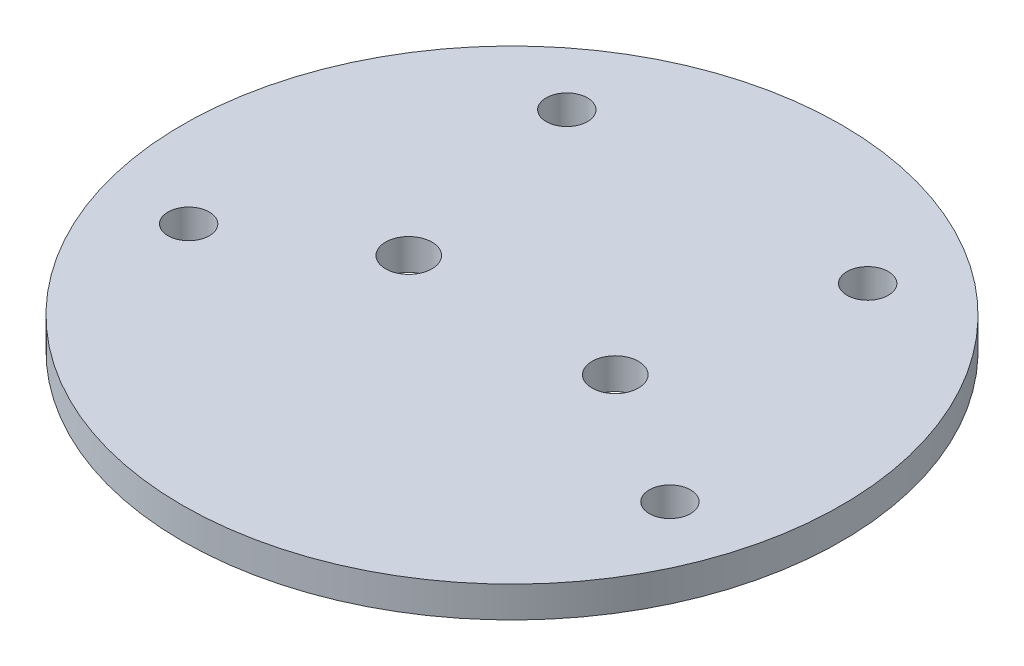
ISO-10303-21;
HEADER;
FILE_DESCRIPTION(('STEP AP214'),'2;1');
FILE_NAME('part.step','',(''),(''),'','','');
FILE_SCHEMA(('AUTOMOTIVE_DESIGN { 1 0 10303 214 1 1 1 1 }'));
ENDSEC;
DATA;
#1=APPLICATION_CONTEXT('core data for automotive mechanical design processes');
#2=APPLICATION_PROTOCOL_DEFINITION('international standard','automotive_design',2000,#1);
#3=PRODUCT_CONTEXT('',#1,'mechanical');
#4=PRODUCT('Part','Part','',(#3));
#5=PRODUCT_RELATED_PRODUCT_CATEGORY('part','',(#4));
#6=PRODUCT_DEFINITION_FORMATION('','',#4);
#7=PRODUCT_DEFINITION_CONTEXT('part definition',#1,'design');
#8=PRODUCT_DEFINITION('design','',#6,#7);
#9=PRODUCT_DEFINITION_SHAPE('','',#8);
#10=(LENGTH_UNIT() NAMED_UNIT(*) SI_UNIT(.MILLI.,.METRE.));
#11=(NAMED_UNIT(*) PLANE_ANGLE_UNIT() SI_UNIT($,.RADIAN.));
#12=(NAMED_UNIT(*) SI_UNIT($,.STERADIAN.) SOLID_ANGLE_UNIT());
#13=UNCERTAINTY_MEASURE_WITH_UNIT(LENGTH_MEASURE(1.E-05),#10,'distance_accuracy_value','');
#14=(GEOMETRIC_REPRESENTATION_CONTEXT(3) GLOBAL_UNCERTAINTY_ASSIGNED_CONTEXT((#13)) GLOBAL_UNIT_ASSIGNED_CONTEXT((#10,
#11,#12)) REPRESENTATION_CONTEXT('',''));
#15=CARTESIAN_POINT('',(0.,0.,0.));
#16=DIRECTION('',(0.,0.,1.));
#17=DIRECTION('',(1.,0.,0.));
#18=AXIS2_PLACEMENT_3D('',#15,#16,#17);
#19=CARTESIAN_POINT('',(0.,4.7752,0.));
#20=DIRECTION('',(0.,1.,0.));
#21=DIRECTION('',(0.,0.,1.));
#22=AXIS2_PLACEMENT_3D('',#19,#20,#21);
#23=PLANE('',#22);
#24=CARTESIAN_POINT('',(23.1297303497822,4.7752,-31.5565202836558));
#25=DIRECTION('',(0.,1.,0.));
#26=DIRECTION('',(0.,0.,-1.));
#27=AXIS2_PLACEMENT_3D('',#24,#25,#26);
#28=CIRCLE('',#27,3.175);
#29=CARTESIAN_POINT('',(23.1297303497822,4.7752,-34.7315202836558));
#30=VERTEX_POINT('',#29);
#31=EDGE_CURVE('E79',#30,#30,#28,.T.);
#32=ORIENTED_EDGE('',*,*,#31,.F.);
#33=EDGE_LOOP('',(#32));
#34=FACE_BOUND('',#33,.T.);
#35=CARTESIAN_POINT('',(-15.875,4.7752,0.));
#36=DIRECTION('',(0.,1.,0.));
#37=DIRECTION('',(0.,0.,1.));
#38=AXIS2_PLACEMENT_3D('',#35,#36,#37);
#39=CIRCLE('',#38,3.5687);
#40=CARTESIAN_POINT('',(-15.875,4.7752,3.5687));
#41=VERTEX_POINT('',#40);
#42=EDGE_CURVE('E67',#41,#41,#39,.T.);
#43=ORIENTED_EDGE('',*,*,#42,.F.);
#44=EDGE_LOOP('',(#43));
#45=FACE_BOUND('',#44,.T.);
#46=CARTESIAN_POINT('',(-37.0004748048183,4.7752,12.7186187412166));
#47=DIRECTION('',(0.,1.,0.));
#48=DIRECTION('',(0.,0.,1.));
#49=AXIS2_PLACEMENT_3D('',#46,#47,#48);
#50=CIRCLE('',#49,3.175);
#51=CARTESIAN_POINT('',(-37.0004748048183,4.7752,15.8936187412166));
#52=VERTEX_POINT('',#51);
#53=EDGE_CURVE('E55',#52,#52,#50,.T.);
#54=ORIENTED_EDGE('',*,*,#53,.F.);
#55=EDGE_LOOP('',(#54));
#56=FACE_BOUND('',#55,.T.);
#57=CARTESIAN_POINT('',(0.,4.7752,0.));
#58=DIRECTION('',(0.,1.,0.));
#59=DIRECTION('',(0.,0.,1.));
#60=AXIS2_PLACEMENT_3D('',#57,#58,#59);
#61=CIRCLE('',#60,50.673);
#62=CARTESIAN_POINT('',(0.,4.7752,50.673));
#63=VERTEX_POINT('',#62);
#64=EDGE_CURVE('E10',#63,#63,#61,.T.);
#65=ORIENTED_EDGE('',*,*,#64,.T.);
#66=EDGE_LOOP('',(#65));
#67=FACE_BOUND('',#66,.T.);
#68=CARTESIAN_POINT('',(-23.1297303497822,4.7752,-31.5565202836558));
#69=DIRECTION('',(0.,1.,0.));
#70=DIRECTION('',(0.,0.,1.));
#71=AXIS2_PLACEMENT_3D('',#68,#69,#70);
#72=CIRCLE('',#71,3.175);
#73=CARTESIAN_POINT('',(-23.1297303497822,4.7752,-28.3815202836558));
#74=VERTEX_POINT('',#73);
#75=EDGE_CURVE('E61',#74,#74,#72,.T.);
#76=ORIENTED_EDGE('',*,*,#75,.F.);
#77=EDGE_LOOP('',(#76));
#78=FACE_BOUND('',#77,.T.);
#79=CARTESIAN_POINT('',(15.875,4.7752,0.));
#80=DIRECTION('',(0.,1.,0.));
#81=DIRECTION('',(0.,0.,1.));
#82=AXIS2_PLACEMENT_3D('',#79,#80,#81);
#83=CIRCLE('',#82,3.5687);
#84=CARTESIAN_POINT('',(15.875,4.7752,3.5687));
#85=VERTEX_POINT('',#84);
#86=EDGE_CURVE('E73',#85,#85,#83,.T.);
#87=ORIENTED_EDGE('',*,*,#86,.F.);
#88=EDGE_LOOP('',(#87));
#89=FACE_BOUND('',#88,.T.);
#90=CARTESIAN_POINT('',(37.0004748048183,4.7752,12.7186187412166));
#91=DIRECTION('',(0.,1.,0.));
#92=DIRECTION('',(0.,0.,-1.));
#93=AXIS2_PLACEMENT_3D('',#90,#91,#92);
#94=CIRCLE('',#93,3.175);
#95=CARTESIAN_POINT('',(37.0004748048183,4.7752,9.54361874121661));
#96=VERTEX_POINT('',#95);
#97=EDGE_CURVE('E85',#96,#96,#94,.T.);
#98=ORIENTED_EDGE('',*,*,#97,.F.);
#99=EDGE_LOOP('',(#98));
#100=FACE_BOUND('',#99,.T.);
#101=ADVANCED_FACE('F41',(#34,#45,#56,#67,#78,#89,#100),#23,.T.);
#102=CARTESIAN_POINT('',(0.,0.,0.));
#103=DIRECTION('',(0.,1.,0.));
#104=DIRECTION('',(0.,0.,1.));
#105=AXIS2_PLACEMENT_3D('',#102,#103,#104);
#106=PLANE('',#105);
#107=CARTESIAN_POINT('',(0.,0.,0.));
#108=DIRECTION('',(0.,1.,0.));
#109=DIRECTION('',(0.,0.,1.));
#110=AXIS2_PLACEMENT_3D('',#107,#108,#109);
#111=CIRCLE('',#110,50.673);
#112=CARTESIAN_POINT('',(0.,0.,50.673));
#113=VERTEX_POINT('',#112);
#114=EDGE_CURVE('E45',#113,#113,#111,.T.);
#115=ORIENTED_EDGE('',*,*,#114,.F.);
#116=EDGE_LOOP('',(#115));
#117=FACE_BOUND('',#116,.T.);
#118=CARTESIAN_POINT('',(-37.0004748048183,0.,12.7186187412166));
#119=DIRECTION('',(0.,1.,0.));
#120=DIRECTION('',(0.,0.,1.));
#121=AXIS2_PLACEMENT_3D('',#118,#119,#120);
#122=CIRCLE('',#121,3.175);
#123=CARTESIAN_POINT('',(-37.0004748048183,0.,15.8936187412166));
#124=VERTEX_POINT('',#123);
#125=EDGE_CURVE('E57',#124,#124,#122,.T.);
#126=ORIENTED_EDGE('',*,*,#125,.T.);
#127=EDGE_LOOP('',(#126));
#128=FACE_BOUND('',#127,.T.);
#129=CARTESIAN_POINT('',(-23.1297303497822,0.,-31.5565202836558));
#130=DIRECTION('',(0.,1.,0.));
#131=DIRECTION('',(0.,0.,1.));
#132=AXIS2_PLACEMENT_3D('',#129,#130,#131);
#133=CIRCLE('',#132,3.175);
#134=CARTESIAN_POINT('',(-23.1297303497822,0.,-28.3815202836558));
#135=VERTEX_POINT('',#134);
#136=EDGE_CURVE('E64',#135,#135,#133,.T.);
#137=ORIENTED_EDGE('',*,*,#136,.T.);
#138=EDGE_LOOP('',(#137));
#139=FACE_BOUND('',#138,.T.);
#140=CARTESIAN_POINT('',(-15.875,0.,0.));
#141=DIRECTION('',(0.,1.,0.));
#142=DIRECTION('',(0.,0.,1.));
#143=AXIS2_PLACEMENT_3D('',#140,#141,#142);
#144=CIRCLE('',#143,3.5687);
#145=CARTESIAN_POINT('',(-15.875,0.,3.5687));
#146=VERTEX_POINT('',#145);
#147=EDGE_CURVE('E70',#146,#146,#144,.T.);
#148=ORIENTED_EDGE('',*,*,#147,.T.);
#149=EDGE_LOOP('',(#148));
#150=FACE_BOUND('',#149,.T.);
#151=CARTESIAN_POINT('',(15.875,0.,0.));
#152=DIRECTION('',(0.,1.,0.));
#153=DIRECTION('',(0.,0.,1.));
#154=AXIS2_PLACEMENT_3D('',#151,#152,#153);
#155=CIRCLE('',#154,3.5687);
#156=CARTESIAN_POINT('',(15.875,0.,3.5687));
#157=VERTEX_POINT('',#156);
#158=EDGE_CURVE('E76',#157,#157,#155,.T.);
#159=ORIENTED_EDGE('',*,*,#158,.T.);
#160=EDGE_LOOP('',(#159));
#161=FACE_BOUND('',#160,.T.);
#162=CARTESIAN_POINT('',(23.1297303497822,0.,-31.5565202836558));
#163=DIRECTION('',(0.,1.,0.));
#164=DIRECTION('',(0.,0.,-1.));
#165=AXIS2_PLACEMENT_3D('',#162,#163,#164);
#166=CIRCLE('',#165,3.175);
#167=CARTESIAN_POINT('',(23.1297303497822,0.,-34.7315202836558));
#168=VERTEX_POINT('',#167);
#169=EDGE_CURVE('E82',#168,#168,#166,.T.);
#170=ORIENTED_EDGE('',*,*,#169,.T.);
#171=EDGE_LOOP('',(#170));
#172=FACE_BOUND('',#171,.T.);
#173=CARTESIAN_POINT('',(37.0004748048183,0.,12.7186187412166));
#174=DIRECTION('',(0.,1.,0.));
#175=DIRECTION('',(0.,0.,-1.));
#176=AXIS2_PLACEMENT_3D('',#173,#174,#175);
#177=CIRCLE('',#176,3.175);
#178=CARTESIAN_POINT('',(37.0004748048183,0.,9.54361874121661));
#179=VERTEX_POINT('',#178);
#180=EDGE_CURVE('E88',#179,#179,#177,.T.);
#181=ORIENTED_EDGE('',*,*,#180,.T.);
#182=EDGE_LOOP('',(#181));
#183=FACE_BOUND('',#182,.T.);
#184=ADVANCED_FACE('F98',(#117,#128,#139,#150,#161,#172,#183),#106,.F.);
#185=CARTESIAN_POINT('',(0.,4.7752,0.));
#186=DIRECTION('',(0.,-1.,0.));
#187=DIRECTION('',(0.,0.,-1.));
#188=AXIS2_PLACEMENT_3D('',#185,#186,#187);
#189=CYLINDRICAL_SURFACE('',#188,50.673);
#190=ORIENTED_EDGE('',*,*,#64,.F.);
#191=EDGE_LOOP('',(#190));
#192=FACE_BOUND('',#191,.T.);
#193=ORIENTED_EDGE('',*,*,#114,.T.);
#194=EDGE_LOOP('',(#193));
#195=FACE_BOUND('',#194,.T.);
#196=ADVANCED_FACE('F43',(#192,#195),#189,.T.);
#197=CARTESIAN_POINT('',(-37.0004748048183,4.7752,12.7186187412166));
#198=DIRECTION('',(0.,-1.,0.));
#199=DIRECTION('',(0.,0.,-1.));
#200=AXIS2_PLACEMENT_3D('',#197,#198,#199);
#201=CYLINDRICAL_SURFACE('',#200,3.175);
#202=ORIENTED_EDGE('',*,*,#53,.T.);
#203=EDGE_LOOP('',(#202));
#204=FACE_BOUND('',#203,.T.);
#205=ORIENTED_EDGE('',*,*,#125,.F.);
#206=EDGE_LOOP('',(#205));
#207=FACE_BOUND('',#206,.T.);
#208=ADVANCED_FACE('F107',(#204,#207),#201,.F.);
#209=CARTESIAN_POINT('',(-23.1297303497822,4.7752,-31.5565202836558));
#210=DIRECTION('',(0.,-1.,0.));
#211=DIRECTION('',(0.,0.,-1.));
#212=AXIS2_PLACEMENT_3D('',#209,#210,#211);
#213=CYLINDRICAL_SURFACE('',#212,3.175);
#214=ORIENTED_EDGE('',*,*,#75,.T.);
#215=EDGE_LOOP('',(#214));
#216=FACE_BOUND('',#215,.T.);
#217=ORIENTED_EDGE('',*,*,#136,.F.);
#218=EDGE_LOOP('',(#217));
#219=FACE_BOUND('',#218,.T.);
#220=ADVANCED_FACE('F110',(#216,#219),#213,.F.);
#221=CARTESIAN_POINT('',(-15.875,4.7752,0.));
#222=DIRECTION('',(0.,-1.,0.));
#223=DIRECTION('',(0.,0.,-1.));
#224=AXIS2_PLACEMENT_3D('',#221,#222,#223);
#225=CYLINDRICAL_SURFACE('',#224,3.5687);
#226=ORIENTED_EDGE('',*,*,#42,.T.);
#227=EDGE_LOOP('',(#226));
#228=FACE_BOUND('',#227,.T.);
#229=ORIENTED_EDGE('',*,*,#147,.F.);
#230=EDGE_LOOP('',(#229));
#231=FACE_BOUND('',#230,.T.);
#232=ADVANCED_FACE('F114',(#228,#231),#225,.F.);
#233=CARTESIAN_POINT('',(15.875,4.7752,0.));
#234=DIRECTION('',(0.,-1.,0.));
#235=DIRECTION('',(0.,0.,-1.));
#236=AXIS2_PLACEMENT_3D('',#233,#234,#235);
#237=CYLINDRICAL_SURFACE('',#236,3.5687);
#238=ORIENTED_EDGE('',*,*,#86,.T.);
#239=EDGE_LOOP('',(#238));
#240=FACE_BOUND('',#239,.T.);
#241=ORIENTED_EDGE('',*,*,#158,.F.);
#242=EDGE_LOOP('',(#241));
#243=FACE_BOUND('',#242,.T.);
#244=ADVANCED_FACE('F118',(#240,#243),#237,.F.);
#245=CARTESIAN_POINT('',(23.1297303497822,4.7752,-31.5565202836558));
#246=DIRECTION('',(0.,-1.,0.));
#247=DIRECTION('',(0.,0.,-1.));
#248=AXIS2_PLACEMENT_3D('',#245,#246,#247);
#249=CYLINDRICAL_SURFACE('',#248,3.175);
#250=ORIENTED_EDGE('',*,*,#31,.T.);
#251=EDGE_LOOP('',(#250));
#252=FACE_BOUND('',#251,.T.);
#253=ORIENTED_EDGE('',*,*,#169,.F.);
#254=EDGE_LOOP('',(#253));
#255=FACE_BOUND('',#254,.T.);
#256=ADVANCED_FACE('F122',(#252,#255),#249,.F.);
#257=CARTESIAN_POINT('',(37.0004748048183,4.7752,12.7186187412166));
#258=DIRECTION('',(0.,-1.,0.));
#259=DIRECTION('',(0.,0.,-1.));
#260=AXIS2_PLACEMENT_3D('',#257,#258,#259);
#261=CYLINDRICAL_SURFACE('',#260,3.175);
#262=ORIENTED_EDGE('',*,*,#97,.T.);
#263=EDGE_LOOP('',(#262));
#264=FACE_BOUND('',#263,.T.);
#265=ORIENTED_EDGE('',*,*,#180,.F.);
#266=EDGE_LOOP('',(#265));
#267=FACE_BOUND('',#266,.T.);
#268=ADVANCED_FACE('F94',(#264,#267),#261,.F.);
#269=CLOSED_SHELL('',(#101,#184,#196,#208,#220,#232,#244,#256,#268));
#270=MANIFOLD_SOLID_BREP('B2',#269);
#271=ADVANCED_BREP_SHAPE_REPRESENTATION('',(#18,#270),#14);
#272=SHAPE_DEFINITION_REPRESENTATION(#9,#271);
ENDSEC;
END-ISO-10303-21;
